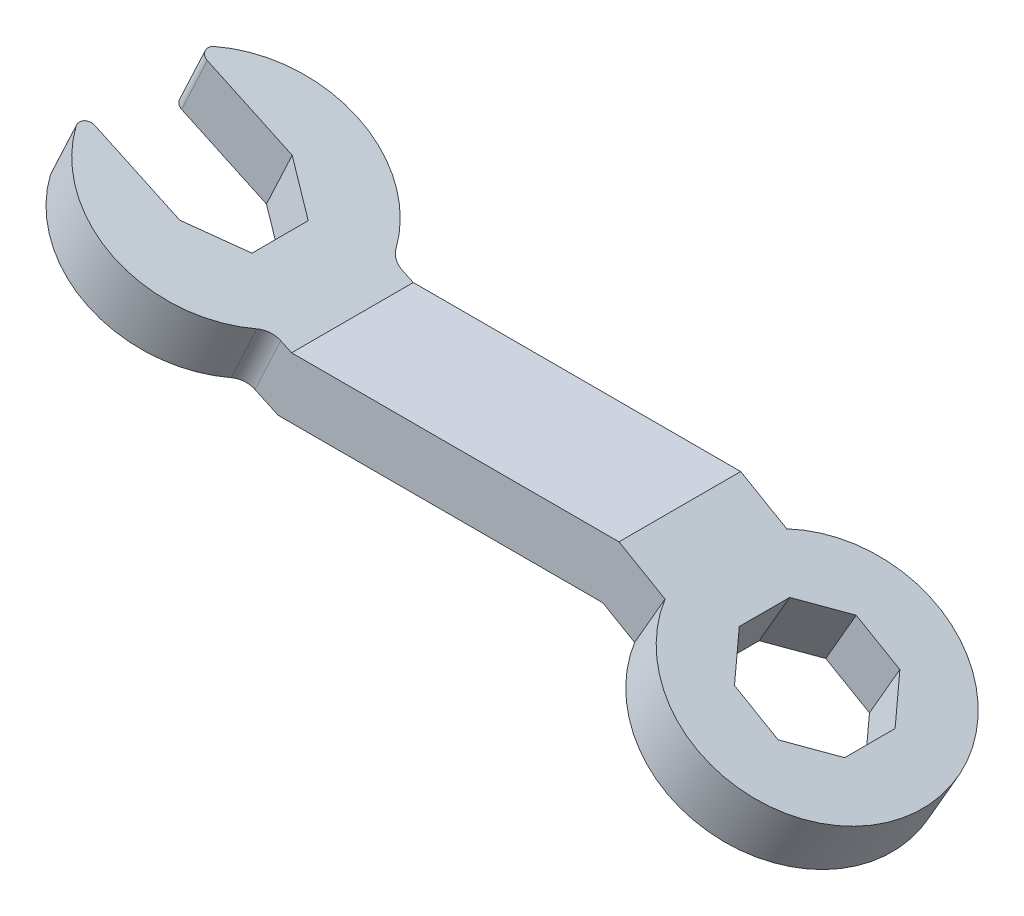
ISO-10303-21;
HEADER;
FILE_DESCRIPTION(('STEP AP214'),'2;1');
FILE_NAME('part.step','',(''),(''),'','','');
FILE_SCHEMA(('AUTOMOTIVE_DESIGN { 1 0 10303 214 1 1 1 1 }'));
ENDSEC;
DATA;
#1=APPLICATION_CONTEXT('core data for automotive mechanical design processes');
#2=APPLICATION_PROTOCOL_DEFINITION('international standard','automotive_design',2000,#1);
#3=PRODUCT_CONTEXT('',#1,'mechanical');
#4=PRODUCT('Part','Part','',(#3));
#5=PRODUCT_RELATED_PRODUCT_CATEGORY('part','',(#4));
#6=PRODUCT_DEFINITION_FORMATION('','',#4);
#7=PRODUCT_DEFINITION_CONTEXT('part definition',#1,'design');
#8=PRODUCT_DEFINITION('design','',#6,#7);
#9=PRODUCT_DEFINITION_SHAPE('','',#8);
#10=(LENGTH_UNIT() NAMED_UNIT(*) SI_UNIT(.MILLI.,.METRE.));
#11=(NAMED_UNIT(*) PLANE_ANGLE_UNIT() SI_UNIT($,.RADIAN.));
#12=(NAMED_UNIT(*) SI_UNIT($,.STERADIAN.) SOLID_ANGLE_UNIT());
#13=UNCERTAINTY_MEASURE_WITH_UNIT(LENGTH_MEASURE(1.E-05),#10,'distance_accuracy_value','');
#14=(GEOMETRIC_REPRESENTATION_CONTEXT(3) GLOBAL_UNCERTAINTY_ASSIGNED_CONTEXT((#13)) GLOBAL_UNIT_ASSIGNED_CONTEXT((#10,
#11,#12)) REPRESENTATION_CONTEXT('',''));
#15=CARTESIAN_POINT('',(0.,0.,0.));
#16=DIRECTION('',(0.,0.,1.));
#17=DIRECTION('',(1.,0.,0.));
#18=AXIS2_PLACEMENT_3D('',#15,#16,#17);
#19=CARTESIAN_POINT('',(0.,0.,15.));
#20=DIRECTION('',(0.422618261740694,0.906307787036653,0.));
#21=DIRECTION('',(-0.906307787036653,0.422618261740694,0.));
#22=AXIS2_PLACEMENT_3D('',#19,#20,#21);
#23=PLANE('',#22);
#24=DIRECTION('',(-0.906307787036653,0.422618261740693,0.));
#25=VECTOR('',#24,1.);
#26=CARTESIAN_POINT('',(0.,0.,-13.856406460551));
#27=LINE('',#26,#25);
#28=CARTESIAN_POINT('',(-31.7207725462829,14.7916391609243,-13.856406460551));
#29=VERTEX_POINT('',#28);
#30=CARTESIAN_POINT('',(-52.636156634353,24.5446429344444,-13.856406460551));
#31=VERTEX_POINT('',#30);
#32=EDGE_CURVE('E294',#29,#31,#27,.T.);
#33=ORIENTED_EDGE('',*,*,#32,.T.);
#34=CARTESIAN_POINT('',(-52.636156634353,24.5446429344444,-15.856406460551));
#35=DIRECTION('',(0.422618261740694,0.906307787036653,0.));
#36=DIRECTION('',(-0.906307787036653,0.422618261740694,0.));
#37=AXIS2_PLACEMENT_3D('',#34,#35,#36);
#38=CIRCLE('',#37,2.);
#39=CARTESIAN_POINT('',(-54.1301126406437,25.2412860611244,-16.989006922019));
#40=VERTEX_POINT('',#39);
#41=EDGE_CURVE('E446',#31,#40,#38,.F.);
#42=ORIENTED_EDGE('',*,*,#41,.T.);
#43=CARTESIAN_POINT('',(-31.7207725462829,14.7916391609243,0.));
#44=DIRECTION('',(-0.422618261740693,-0.906307787036653,0.));
#45=DIRECTION('',(0.906307787036653,-0.422618261740694,0.));
#46=AXIS2_PLACEMENT_3D('',#43,#44,#45);
#47=CIRCLE('',#46,30.);
#48=CARTESIAN_POINT('',(-9.40787886195159,4.38696596032248,-17.1428571428571));
#49=VERTEX_POINT('',#48);
#50=EDGE_CURVE('E299',#40,#49,#47,.T.);
#51=ORIENTED_EDGE('',*,*,#50,.T.);
#52=CARTESIAN_POINT('',(-5.68906324789638,2.65285376022218,-20.));
#53=DIRECTION('',(0.422618261740694,0.906307787036653,0.));
#54=DIRECTION('',(-0.906307787036653,0.422618261740694,0.));
#55=AXIS2_PLACEMENT_3D('',#52,#53,#54);
#56=CIRCLE('',#55,5.);
#57=CARTESIAN_POINT('',(-5.68906324789638,2.65285376022218,-15.));
#58=VERTEX_POINT('',#57);
#59=EDGE_CURVE('E435',#49,#58,#56,.T.);
#60=ORIENTED_EDGE('',*,*,#59,.T.);
#61=DIRECTION('',(0.906307787036653,-0.422618261740694,0.));
#62=VECTOR('',#61,1.);
#63=CARTESIAN_POINT('',(0.,0.,-15.));
#64=LINE('',#63,#62);
#65=CARTESIAN_POINT('',(0.,0.,-15.));
#66=VERTEX_POINT('',#65);
#67=EDGE_CURVE('E330',#58,#66,#64,.T.);
#68=ORIENTED_EDGE('',*,*,#67,.T.);
#69=DIRECTION('',(0.,0.,-1.));
#70=VECTOR('',#69,1.);
#71=CARTESIAN_POINT('',(0.,0.,15.));
#72=LINE('',#71,#70);
#73=CARTESIAN_POINT('',(0.,0.,15.));
#74=VERTEX_POINT('',#73);
#75=EDGE_CURVE('E380',#74,#66,#72,.T.);
#76=ORIENTED_EDGE('',*,*,#75,.F.);
#77=DIRECTION('',(0.906307787036653,-0.422618261740694,0.));
#78=VECTOR('',#77,1.);
#79=CARTESIAN_POINT('',(0.,0.,15.));
#80=LINE('',#79,#78);
#81=CARTESIAN_POINT('',(-5.68906324789638,2.65285376022218,15.));
#82=VERTEX_POINT('',#81);
#83=EDGE_CURVE('E406',#82,#74,#80,.T.);
#84=ORIENTED_EDGE('',*,*,#83,.F.);
#85=CARTESIAN_POINT('',(-5.68906324789638,2.65285376022218,20.));
#86=DIRECTION('',(0.422618261740694,0.906307787036653,0.));
#87=DIRECTION('',(-0.906307787036653,0.422618261740694,0.));
#88=AXIS2_PLACEMENT_3D('',#85,#86,#87);
#89=CIRCLE('',#88,5.);
#90=CARTESIAN_POINT('',(-9.40787886195159,4.38696596032248,17.1428571428571));
#91=VERTEX_POINT('',#90);
#92=EDGE_CURVE('E439',#82,#91,#89,.T.);
#93=ORIENTED_EDGE('',*,*,#92,.T.);
#94=CARTESIAN_POINT('',(-54.1301126406438,25.2412860611244,16.9890069220189));
#95=VERTEX_POINT('',#94);
#96=EDGE_CURVE('E297',#91,#95,#47,.T.);
#97=ORIENTED_EDGE('',*,*,#96,.T.);
#98=CARTESIAN_POINT('',(-52.636156634353,24.5446429344444,15.856406460551));
#99=DIRECTION('',(0.422618261740694,0.906307787036653,0.));
#100=DIRECTION('',(-0.906307787036653,0.422618261740694,0.));
#101=AXIS2_PLACEMENT_3D('',#98,#99,#100);
#102=CIRCLE('',#101,2.);
#103=CARTESIAN_POINT('',(-52.636156634353,24.5446429344444,13.856406460551));
#104=VERTEX_POINT('',#103);
#105=EDGE_CURVE('E444',#95,#104,#102,.F.);
#106=ORIENTED_EDGE('',*,*,#105,.T.);
#107=DIRECTION('',(-0.906307787036653,0.422618261740693,0.));
#108=VECTOR('',#107,1.);
#109=CARTESIAN_POINT('',(0.,0.,13.856406460551));
#110=LINE('',#109,#108);
#111=CARTESIAN_POINT('',(-31.7207725462829,14.7916391609243,13.856406460551));
#112=VERTEX_POINT('',#111);
#113=EDGE_CURVE('E301',#112,#104,#110,.T.);
#114=ORIENTED_EDGE('',*,*,#113,.F.);
#115=DIRECTION('',(0.784885567221399,-0.365998150770662,-0.5));
#116=VECTOR('',#115,1.);
#117=CARTESIAN_POINT('',(-8.37898816851127,3.90718635056686,-1.01313972081441));
#118=LINE('',#117,#116);
#119=CARTESIAN_POINT('',(-20.845079101843,9.72022002003597,6.92820323027551));
#120=VERTEX_POINT('',#119);
#121=EDGE_CURVE('E275',#112,#120,#118,.T.);
#122=ORIENTED_EDGE('',*,*,#121,.T.);
#123=DIRECTION('',(0.,0.,-1.));
#124=VECTOR('',#123,1.);
#125=CARTESIAN_POINT('',(-20.845079101843,9.72022002003596,15.));
#126=LINE('',#125,#124);
#127=CARTESIAN_POINT('',(-20.845079101843,9.72022002003597,-6.92820323027551));
#128=VERTEX_POINT('',#127);
#129=EDGE_CURVE('E298',#120,#128,#126,.T.);
#130=ORIENTED_EDGE('',*,*,#129,.T.);
#131=DIRECTION('',(-0.784885567221398,0.365998150770662,-0.5));
#132=VECTOR('',#131,1.);
#133=CARTESIAN_POINT('',(3.39429533980969,-1.58278591099305,8.51313972081442));
#134=LINE('',#133,#132);
#135=EDGE_CURVE('E476',#128,#29,#134,.T.);
#136=ORIENTED_EDGE('',*,*,#135,.T.);
#137=EDGE_LOOP('',(#33,#42,#51,#60,#68,#76,#84,#93,#97,#106,#114,#122,#130,#136));
#138=FACE_BOUND('',#137,.T.);
#139=ADVANCED_FACE('F95',(#138),#23,.F.);
#140=CARTESIAN_POINT('',(0.,0.,15.));
#141=DIRECTION('',(0.,1.,0.));
#142=DIRECTION('',(0.,0.,1.));
#143=AXIS2_PLACEMENT_3D('',#140,#141,#142);
#144=PLANE('',#143);
#145=DIRECTION('',(1.,0.,0.));
#146=VECTOR('',#145,1.);
#147=CARTESIAN_POINT('',(0.,0.,-15.));
#148=LINE('',#147,#146);
#149=CARTESIAN_POINT('',(80.,0.,-15.));
#150=VERTEX_POINT('',#149);
#151=EDGE_CURVE('E384',#66,#150,#148,.T.);
#152=ORIENTED_EDGE('',*,*,#151,.T.);
#153=DIRECTION('',(0.,0.,-1.));
#154=VECTOR('',#153,1.);
#155=CARTESIAN_POINT('',(80.,0.,15.));
#156=LINE('',#155,#154);
#157=CARTESIAN_POINT('',(80.,0.,15.));
#158=VERTEX_POINT('',#157);
#159=EDGE_CURVE('E385',#158,#150,#156,.T.);
#160=ORIENTED_EDGE('',*,*,#159,.F.);
#161=DIRECTION('',(1.,0.,0.));
#162=VECTOR('',#161,1.);
#163=CARTESIAN_POINT('',(0.,0.,15.));
#164=LINE('',#163,#162);
#165=EDGE_CURVE('E409',#74,#158,#164,.T.);
#166=ORIENTED_EDGE('',*,*,#165,.F.);
#167=ORIENTED_EDGE('',*,*,#75,.T.);
#168=EDGE_LOOP('',(#152,#160,#166,#167));
#169=FACE_BOUND('',#168,.T.);
#170=ADVANCED_FACE('F493',(#169),#144,.F.);
#171=CARTESIAN_POINT('',(80.,0.,15.));
#172=DIRECTION('',(0.500000000000001,0.866025403784438,0.));
#173=DIRECTION('',(-0.866025403784438,0.500000000000002,0.));
#174=AXIS2_PLACEMENT_3D('',#171,#172,#173);
#175=PLANE('',#174);
#176=DIRECTION('',(0.866025403784438,-0.500000000000002,0.));
#177=VECTOR('',#176,1.);
#178=CARTESIAN_POINT('',(80.,0.,-15.));
#179=LINE('',#178,#177);
#180=CARTESIAN_POINT('',(87.8656981257962,-4.54126293029279,-15.));
#181=VERTEX_POINT('',#180);
#182=EDGE_CURVE('E383',#150,#181,#179,.T.);
#183=ORIENTED_EDGE('',*,*,#182,.T.);
#184=CARTESIAN_POINT('',(110.365698125796,-17.5316439870594,0.));
#185=DIRECTION('',(0.500000000000001,0.866025403784438,0.));
#186=DIRECTION('',(-0.866025403784438,0.500000000000002,0.));
#187=AXIS2_PLACEMENT_3D('',#184,#185,#186);
#188=CIRCLE('',#187,30.);
#189=CARTESIAN_POINT('',(87.8656981257962,-4.54126293029278,15.));
#190=VERTEX_POINT('',#189);
#191=EDGE_CURVE('E309',#181,#190,#188,.F.);
#192=ORIENTED_EDGE('',*,*,#191,.T.);
#193=DIRECTION('',(0.866025403784438,-0.500000000000002,0.));
#194=VECTOR('',#193,1.);
#195=CARTESIAN_POINT('',(80.,0.,15.));
#196=LINE('',#195,#194);
#197=EDGE_CURVE('E379',#158,#190,#196,.T.);
#198=ORIENTED_EDGE('',*,*,#197,.F.);
#199=ORIENTED_EDGE('',*,*,#159,.T.);
#200=EDGE_LOOP('',(#183,#192,#198,#199));
#201=FACE_BOUND('',#200,.T.);
#202=DIRECTION('',(0.,0.,1.));
#203=VECTOR('',#202,1.);
#204=CARTESIAN_POINT('',(123.356079182563,-25.0316439870594,6.21320343559643));
#205=LINE('',#204,#203);
#206=CARTESIAN_POINT('',(123.356079182563,-25.0316439870594,-6.21320343559644));
#207=VERTEX_POINT('',#206);
#208=CARTESIAN_POINT('',(123.356079182563,-25.0316439870594,6.21320343559643));
#209=VERTEX_POINT('',#208);
#210=EDGE_CURVE('E328',#207,#209,#205,.T.);
#211=ORIENTED_EDGE('',*,*,#210,.F.);
#212=DIRECTION('',(0.612372435695794,-0.353553390593275,0.707106781186548));
#213=VECTOR('',#212,1.);
#214=CARTESIAN_POINT('',(123.356079182563,-25.0316439870594,-6.21320343559642));
#215=LINE('',#214,#213);
#216=CARTESIAN_POINT('',(115.746490139903,-20.6382457048576,-15.));
#217=VERTEX_POINT('',#216);
#218=EDGE_CURVE('E306',#217,#207,#215,.T.);
#219=ORIENTED_EDGE('',*,*,#218,.F.);
#220=DIRECTION('',(0.866025403784438,-0.500000000000001,0.));
#221=VECTOR('',#220,1.);
#222=CARTESIAN_POINT('',(115.746490139903,-20.6382457048576,-15.));
#223=LINE('',#222,#221);
#224=CARTESIAN_POINT('',(104.984906111689,-14.4250422692612,-15.));
#225=VERTEX_POINT('',#224);
#226=EDGE_CURVE('E310',#225,#217,#223,.T.);
#227=ORIENTED_EDGE('',*,*,#226,.F.);
#228=DIRECTION('',(0.612372435695794,-0.353553390593275,-0.707106781186548));
#229=VECTOR('',#228,1.);
#230=CARTESIAN_POINT('',(104.984906111689,-14.4250422692612,-15.));
#231=LINE('',#230,#229);
#232=CARTESIAN_POINT('',(97.3753170690296,-10.0316439870594,-6.21320343559641));
#233=VERTEX_POINT('',#232);
#234=EDGE_CURVE('E313',#233,#225,#231,.T.);
#235=ORIENTED_EDGE('',*,*,#234,.F.);
#236=DIRECTION('',(0.,0.,-1.));
#237=VECTOR('',#236,1.);
#238=CARTESIAN_POINT('',(97.3753170690296,-10.0316439870594,-6.21320343559641));
#239=LINE('',#238,#237);
#240=CARTESIAN_POINT('',(97.3753170690296,-10.0316439870594,6.21320343559641));
#241=VERTEX_POINT('',#240);
#242=EDGE_CURVE('E316',#241,#233,#239,.T.);
#243=ORIENTED_EDGE('',*,*,#242,.F.);
#244=DIRECTION('',(-0.612372435695794,0.353553390593275,-0.707106781186547));
#245=VECTOR('',#244,1.);
#246=CARTESIAN_POINT('',(97.3753170690296,-10.0316439870594,6.21320343559642));
#247=LINE('',#246,#245);
#248=CARTESIAN_POINT('',(104.984906111689,-14.4250422692612,15.));
#249=VERTEX_POINT('',#248);
#250=EDGE_CURVE('E319',#249,#241,#247,.T.);
#251=ORIENTED_EDGE('',*,*,#250,.F.);
#252=DIRECTION('',(-0.866025403784438,0.500000000000001,0.));
#253=VECTOR('',#252,1.);
#254=CARTESIAN_POINT('',(104.984906111689,-14.4250422692612,15.));
#255=LINE('',#254,#253);
#256=CARTESIAN_POINT('',(115.746490139903,-20.6382457048576,15.));
#257=VERTEX_POINT('',#256);
#258=EDGE_CURVE('E322',#257,#249,#255,.T.);
#259=ORIENTED_EDGE('',*,*,#258,.F.);
#260=DIRECTION('',(-0.612372435695794,0.353553390593275,0.707106781186548));
#261=VECTOR('',#260,1.);
#262=CARTESIAN_POINT('',(115.746490139903,-20.6382457048576,15.));
#263=LINE('',#262,#261);
#264=EDGE_CURVE('E325',#209,#257,#263,.T.);
#265=ORIENTED_EDGE('',*,*,#264,.F.);
#266=EDGE_LOOP('',(#211,#219,#227,#235,#243,#251,#259,#265));
#267=FACE_BOUND('',#266,.T.);
#268=ADVANCED_FACE('F500',(#201,#267),#175,.F.);
#269=CARTESIAN_POINT('',(114.330127018922,-2.50000000000004,15.));
#270=DIRECTION('',(-0.500000000000002,-0.866025403784438,0.));
#271=DIRECTION('',(0.866025403784438,-0.500000000000002,0.));
#272=AXIS2_PLACEMENT_3D('',#269,#270,#271);
#273=PLANE('',#272);
#274=DIRECTION('',(-0.866025403784438,0.500000000000002,0.));
#275=VECTOR('',#274,1.);
#276=CARTESIAN_POINT('',(114.330127018922,-2.50000000000004,15.));
#277=LINE('',#276,#275);
#278=CARTESIAN_POINT('',(95.3656981257962,8.44911812647381,15.));
#279=VERTEX_POINT('',#278);
#280=CARTESIAN_POINT('',(84.0192378864669,15.,15.));
#281=VERTEX_POINT('',#280);
#282=EDGE_CURVE('E397',#279,#281,#277,.T.);
#283=ORIENTED_EDGE('',*,*,#282,.F.);
#284=CARTESIAN_POINT('',(117.865698125796,-4.5412629302928,0.));
#285=DIRECTION('',(0.500000000000001,0.866025403784438,0.));
#286=DIRECTION('',(-0.866025403784438,0.500000000000001,0.));
#287=AXIS2_PLACEMENT_3D('',#284,#285,#286);
#288=CIRCLE('',#287,30.);
#289=CARTESIAN_POINT('',(95.3656981257962,8.44911812647381,-15.));
#290=VERTEX_POINT('',#289);
#291=EDGE_CURVE('E357',#279,#290,#288,.T.);
#292=ORIENTED_EDGE('',*,*,#291,.T.);
#293=DIRECTION('',(-0.866025403784438,0.500000000000002,0.));
#294=VECTOR('',#293,1.);
#295=CARTESIAN_POINT('',(114.330127018922,-2.50000000000004,-15.));
#296=LINE('',#295,#294);
#297=CARTESIAN_POINT('',(84.0192378864669,15.,-15.));
#298=VERTEX_POINT('',#297);
#299=EDGE_CURVE('E388',#290,#298,#296,.T.);
#300=ORIENTED_EDGE('',*,*,#299,.T.);
#301=DIRECTION('',(0.,0.,-1.));
#302=VECTOR('',#301,1.);
#303=CARTESIAN_POINT('',(84.0192378864669,15.,15.));
#304=LINE('',#303,#302);
#305=EDGE_CURVE('E389',#281,#298,#304,.T.);
#306=ORIENTED_EDGE('',*,*,#305,.F.);
#307=EDGE_LOOP('',(#283,#292,#300,#306));
#308=FACE_BOUND('',#307,.T.);
#309=DIRECTION('',(0.612372435695794,-0.353553390593274,-0.707106781186548));
#310=VECTOR('',#309,1.);
#311=CARTESIAN_POINT('',(123.246490139903,-7.64786464809102,15.));
#312=LINE('',#311,#310);
#313=CARTESIAN_POINT('',(123.246490139903,-7.64786464809102,15.));
#314=VERTEX_POINT('',#313);
#315=CARTESIAN_POINT('',(130.856079182563,-12.0412629302928,6.21320343559643));
#316=VERTEX_POINT('',#315);
#317=EDGE_CURVE('E304',#314,#316,#312,.T.);
#318=ORIENTED_EDGE('',*,*,#317,.F.);
#319=DIRECTION('',(0.866025403784438,-0.500000000000001,0.));
#320=VECTOR('',#319,1.);
#321=CARTESIAN_POINT('',(112.484906111689,-1.43466121249459,15.));
#322=LINE('',#321,#320);
#323=CARTESIAN_POINT('',(112.484906111689,-1.43466121249459,15.));
#324=VERTEX_POINT('',#323);
#325=EDGE_CURVE('E351',#324,#314,#322,.T.);
#326=ORIENTED_EDGE('',*,*,#325,.F.);
#327=DIRECTION('',(0.612372435695794,-0.353553390593275,0.707106781186547));
#328=VECTOR('',#327,1.);
#329=CARTESIAN_POINT('',(104.87531706903,2.95873706970722,6.21320343559641));
#330=LINE('',#329,#328);
#331=CARTESIAN_POINT('',(104.87531706903,2.95873706970722,6.21320343559641));
#332=VERTEX_POINT('',#331);
#333=EDGE_CURVE('E348',#332,#324,#330,.T.);
#334=ORIENTED_EDGE('',*,*,#333,.F.);
#335=DIRECTION('',(0.,0.,1.));
#336=VECTOR('',#335,1.);
#337=CARTESIAN_POINT('',(104.87531706903,2.95873706970722,-6.21320343559641));
#338=LINE('',#337,#336);
#339=CARTESIAN_POINT('',(104.87531706903,2.95873706970722,-6.21320343559641));
#340=VERTEX_POINT('',#339);
#341=EDGE_CURVE('E345',#340,#332,#338,.T.);
#342=ORIENTED_EDGE('',*,*,#341,.F.);
#343=DIRECTION('',(-0.612372435695794,0.353553390593274,0.707106781186547));
#344=VECTOR('',#343,1.);
#345=CARTESIAN_POINT('',(112.484906111689,-1.43466121249458,-15.));
#346=LINE('',#345,#344);
#347=CARTESIAN_POINT('',(112.484906111689,-1.43466121249458,-15.));
#348=VERTEX_POINT('',#347);
#349=EDGE_CURVE('E342',#348,#340,#346,.T.);
#350=ORIENTED_EDGE('',*,*,#349,.F.);
#351=DIRECTION('',(-0.866025403784438,0.500000000000001,0.));
#352=VECTOR('',#351,1.);
#353=CARTESIAN_POINT('',(123.246490139903,-7.64786464809102,-15.));
#354=LINE('',#353,#352);
#355=CARTESIAN_POINT('',(123.246490139903,-7.64786464809102,-15.));
#356=VERTEX_POINT('',#355);
#357=EDGE_CURVE('E339',#356,#348,#354,.T.);
#358=ORIENTED_EDGE('',*,*,#357,.F.);
#359=DIRECTION('',(-0.612372435695793,0.353553390593275,-0.707106781186548));
#360=VECTOR('',#359,1.);
#361=CARTESIAN_POINT('',(130.856079182563,-12.0412629302928,-6.21320343559644));
#362=LINE('',#361,#360);
#363=CARTESIAN_POINT('',(130.856079182563,-12.0412629302928,-6.21320343559644));
#364=VERTEX_POINT('',#363);
#365=EDGE_CURVE('E336',#364,#356,#362,.T.);
#366=ORIENTED_EDGE('',*,*,#365,.F.);
#367=DIRECTION('',(0.,0.,-1.));
#368=VECTOR('',#367,1.);
#369=CARTESIAN_POINT('',(130.856079182563,-12.0412629302928,6.21320343559643));
#370=LINE('',#369,#368);
#371=EDGE_CURVE('E333',#316,#364,#370,.T.);
#372=ORIENTED_EDGE('',*,*,#371,.F.);
#373=EDGE_LOOP('',(#318,#326,#334,#342,#350,#358,#366,#372));
#374=FACE_BOUND('',#373,.T.);
#375=ADVANCED_FACE('F510',(#308,#374),#273,.F.);
#376=CARTESIAN_POINT('',(84.0192378864669,15.,15.));
#377=DIRECTION('',(0.,-1.,0.));
#378=DIRECTION('',(1.,0.,0.));
#379=AXIS2_PLACEMENT_3D('',#376,#377,#378);
#380=PLANE('',#379);
#381=DIRECTION('',(-1.,0.,0.));
#382=VECTOR('',#381,1.);
#383=CARTESIAN_POINT('',(84.0192378864669,15.,-15.));
#384=LINE('',#383,#382);
#385=CARTESIAN_POINT('',(3.32541993964407,15.,-15.));
#386=VERTEX_POINT('',#385);
#387=EDGE_CURVE('E393',#298,#386,#384,.T.);
#388=ORIENTED_EDGE('',*,*,#387,.T.);
#389=DIRECTION('',(0.,0.,-1.));
#390=VECTOR('',#389,1.);
#391=CARTESIAN_POINT('',(3.32541993964407,15.,15.));
#392=LINE('',#391,#390);
#393=CARTESIAN_POINT('',(3.32541993964407,15.,15.));
#394=VERTEX_POINT('',#393);
#395=EDGE_CURVE('E394',#394,#386,#392,.T.);
#396=ORIENTED_EDGE('',*,*,#395,.F.);
#397=DIRECTION('',(-1.,0.,0.));
#398=VECTOR('',#397,1.);
#399=CARTESIAN_POINT('',(84.0192378864669,15.,15.));
#400=LINE('',#399,#398);
#401=EDGE_CURVE('E407',#281,#394,#400,.T.);
#402=ORIENTED_EDGE('',*,*,#401,.F.);
#403=ORIENTED_EDGE('',*,*,#305,.T.);
#404=EDGE_LOOP('',(#388,#396,#402,#403));
#405=FACE_BOUND('',#404,.T.);
#406=ADVANCED_FACE('F507',(#405),#380,.F.);
#407=CARTESIAN_POINT('',(3.32541993964407,15.,15.));
#408=DIRECTION('',(-0.422618261740694,-0.906307787036653,0.));
#409=DIRECTION('',(0.906307787036653,-0.422618261740694,0.));
#410=AXIS2_PLACEMENT_3D('',#407,#408,#409);
#411=PLANE('',#410);
#412=CARTESIAN_POINT('',(-25.3814986201725,28.3862559664741,0.));
#413=DIRECTION('',(-0.422618261740693,-0.906307787036653,0.));
#414=DIRECTION('',(0.906307787036653,-0.422618261740694,0.));
#415=AXIS2_PLACEMENT_3D('',#412,#413,#414);
#416=CIRCLE('',#415,30.);
#417=CARTESIAN_POINT('',(-47.7908387145333,38.8359028666742,-16.989006922019));
#418=VERTEX_POINT('',#417);
#419=CARTESIAN_POINT('',(-3.06860493584119,17.9815827658723,-17.1428571428571));
#420=VERTEX_POINT('',#419);
#421=EDGE_CURVE('E288',#418,#420,#416,.T.);
#422=ORIENTED_EDGE('',*,*,#421,.F.);
#423=CARTESIAN_POINT('',(-46.2968827082426,38.1392597399942,-15.856406460551));
#424=DIRECTION('',(-0.422618261740694,-0.906307787036653,0.));
#425=DIRECTION('',(0.906307787036653,-0.422618261740694,0.));
#426=AXIS2_PLACEMENT_3D('',#423,#424,#425);
#427=CIRCLE('',#426,2.);
#428=CARTESIAN_POINT('',(-46.2968827082426,38.1392597399942,-13.856406460551));
#429=VERTEX_POINT('',#428);
#430=EDGE_CURVE('E451',#418,#429,#427,.F.);
#431=ORIENTED_EDGE('',*,*,#430,.T.);
#432=DIRECTION('',(-0.906307787036653,0.422618261740693,0.));
#433=VECTOR('',#432,1.);
#434=CARTESIAN_POINT('',(6.3392739261104,13.5946168055498,-13.856406460551));
#435=LINE('',#434,#433);
#436=CARTESIAN_POINT('',(-25.3814986201725,28.3862559664741,-13.856406460551));
#437=VERTEX_POINT('',#436);
#438=EDGE_CURVE('E303',#437,#429,#435,.T.);
#439=ORIENTED_EDGE('',*,*,#438,.F.);
#440=DIRECTION('',(0.784885567221398,-0.365998150770662,0.5));
#441=VECTOR('',#440,1.);
#442=CARTESIAN_POINT('',(7.47317877607034,13.0658682903944,7.0731906478229));
#443=LINE('',#442,#441);
#444=CARTESIAN_POINT('',(-14.5058051757326,23.3148368255857,-6.92820323027551));
#445=VERTEX_POINT('',#444);
#446=EDGE_CURVE('E479',#437,#445,#443,.T.);
#447=ORIENTED_EDGE('',*,*,#446,.T.);
#448=DIRECTION('',(0.,0.,1.));
#449=VECTOR('',#448,1.);
#450=CARTESIAN_POINT('',(-14.5058051757326,23.3148368255858,15.));
#451=LINE('',#450,#449);
#452=CARTESIAN_POINT('',(-14.5058051757326,23.3148368255857,6.92820323027551));
#453=VERTEX_POINT('',#452);
#454=EDGE_CURVE('E284',#445,#453,#451,.T.);
#455=ORIENTED_EDGE('',*,*,#454,.T.);
#456=DIRECTION('',(-0.784885567221399,0.365998150770662,0.5));
#457=VECTOR('',#456,1.);
#458=CARTESIAN_POINT('',(-4.30010473225062,18.5558405519543,0.426809352177102));
#459=LINE('',#458,#457);
#460=CARTESIAN_POINT('',(-25.3814986201725,28.3862559664741,13.856406460551));
#461=VERTEX_POINT('',#460);
#462=EDGE_CURVE('E272',#453,#461,#459,.T.);
#463=ORIENTED_EDGE('',*,*,#462,.T.);
#464=DIRECTION('',(-0.906307787036653,0.422618261740693,0.));
#465=VECTOR('',#464,1.);
#466=CARTESIAN_POINT('',(6.3392739261104,13.5946168055498,13.856406460551));
#467=LINE('',#466,#465);
#468=CARTESIAN_POINT('',(-46.2968827082426,38.1392597399942,13.856406460551));
#469=VERTEX_POINT('',#468);
#470=EDGE_CURVE('E278',#461,#469,#467,.T.);
#471=ORIENTED_EDGE('',*,*,#470,.T.);
#472=CARTESIAN_POINT('',(-46.2968827082426,38.1392597399942,15.856406460551));
#473=DIRECTION('',(-0.422618261740694,-0.906307787036653,0.));
#474=DIRECTION('',(0.906307787036653,-0.422618261740694,0.));
#475=AXIS2_PLACEMENT_3D('',#472,#473,#474);
#476=CIRCLE('',#475,2.);
#477=CARTESIAN_POINT('',(-47.7908387145334,38.8359028666742,16.9890069220189));
#478=VERTEX_POINT('',#477);
#479=EDGE_CURVE('E110',#469,#478,#476,.F.);
#480=ORIENTED_EDGE('',*,*,#479,.T.);
#481=CARTESIAN_POINT('',(-3.06860493584119,17.9815827658723,17.1428571428571));
#482=VERTEX_POINT('',#481);
#483=EDGE_CURVE('E290',#482,#478,#416,.T.);
#484=ORIENTED_EDGE('',*,*,#483,.F.);
#485=CARTESIAN_POINT('',(0.650210678214026,16.247470565772,20.));
#486=DIRECTION('',(-0.422618261740694,-0.906307787036653,0.));
#487=DIRECTION('',(0.906307787036653,-0.422618261740694,0.));
#488=AXIS2_PLACEMENT_3D('',#485,#486,#487);
#489=CIRCLE('',#488,5.);
#490=CARTESIAN_POINT('',(0.650210678214026,16.247470565772,15.));
#491=VERTEX_POINT('',#490);
#492=EDGE_CURVE('E437',#482,#491,#489,.T.);
#493=ORIENTED_EDGE('',*,*,#492,.T.);
#494=DIRECTION('',(-0.906307787036653,0.422618261740694,0.));
#495=VECTOR('',#494,1.);
#496=CARTESIAN_POINT('',(3.32541993964407,15.,15.));
#497=LINE('',#496,#495);
#498=EDGE_CURVE('E403',#394,#491,#497,.T.);
#499=ORIENTED_EDGE('',*,*,#498,.F.);
#500=ORIENTED_EDGE('',*,*,#395,.T.);
#501=DIRECTION('',(-0.906307787036653,0.422618261740694,0.));
#502=VECTOR('',#501,1.);
#503=CARTESIAN_POINT('',(3.32541993964407,15.,-15.));
#504=LINE('',#503,#502);
#505=CARTESIAN_POINT('',(0.650210678214027,16.247470565772,-15.));
#506=VERTEX_POINT('',#505);
#507=EDGE_CURVE('E392',#386,#506,#504,.T.);
#508=ORIENTED_EDGE('',*,*,#507,.T.);
#509=CARTESIAN_POINT('',(0.650210678214026,16.247470565772,-20.));
#510=DIRECTION('',(-0.422618261740694,-0.906307787036653,0.));
#511=DIRECTION('',(0.906307787036653,-0.422618261740694,0.));
#512=AXIS2_PLACEMENT_3D('',#509,#510,#511);
#513=CIRCLE('',#512,5.);
#514=EDGE_CURVE('E432',#506,#420,#513,.T.);
#515=ORIENTED_EDGE('',*,*,#514,.T.);
#516=EDGE_LOOP('',(#422,#431,#439,#447,#455,#463,#471,#480,#484,#493,#499,#500,#508,#515));
#517=FACE_BOUND('',#516,.T.);
#518=ADVANCED_FACE('F282',(#517),#411,.F.);
#519=CARTESIAN_POINT('',(0.,0.,15.));
#520=DIRECTION('',(0.,0.,1.));
#521=DIRECTION('',(1.,0.,0.));
#522=AXIS2_PLACEMENT_3D('',#519,#520,#521);
#523=PLANE('',#522);
#524=ORIENTED_EDGE('',*,*,#498,.T.);
#525=DIRECTION('',(0.422618261740694,0.906307787036653,0.));
#526=VECTOR('',#525,1.);
#527=CARTESIAN_POINT('',(-5.68906324789638,2.65285376022218,15.));
#528=LINE('',#527,#526);
#529=EDGE_CURVE('E430',#491,#82,#528,.F.);
#530=ORIENTED_EDGE('',*,*,#529,.T.);
#531=ORIENTED_EDGE('',*,*,#83,.T.);
#532=ORIENTED_EDGE('',*,*,#165,.T.);
#533=ORIENTED_EDGE('',*,*,#197,.T.);
#534=DIRECTION('',(0.500000000000001,0.866025403784438,0.));
#535=VECTOR('',#534,1.);
#536=CARTESIAN_POINT('',(53.2279732344948,-64.5355623006198,15.));
#537=LINE('',#536,#535);
#538=EDGE_CURVE('E378',#279,#190,#537,.F.);
#539=ORIENTED_EDGE('',*,*,#538,.F.);
#540=ORIENTED_EDGE('',*,*,#282,.T.);
#541=ORIENTED_EDGE('',*,*,#401,.T.);
#542=EDGE_LOOP('',(#524,#530,#531,#532,#533,#539,#540,#541));
#543=FACE_BOUND('',#542,.T.);
#544=ADVANCED_FACE('F513',(#543),#523,.T.);
#545=CARTESIAN_POINT('',(0.,0.,-15.));
#546=DIRECTION('',(0.,0.,1.));
#547=DIRECTION('',(1.,0.,0.));
#548=AXIS2_PLACEMENT_3D('',#545,#546,#547);
#549=PLANE('',#548);
#550=ORIENTED_EDGE('',*,*,#67,.F.);
#551=DIRECTION('',(-0.422618261740694,-0.906307787036653,0.));
#552=VECTOR('',#551,1.);
#553=CARTESIAN_POINT('',(-5.68906324789638,2.65285376022218,-15.));
#554=LINE('',#553,#552);
#555=EDGE_CURVE('E421',#58,#506,#554,.F.);
#556=ORIENTED_EDGE('',*,*,#555,.T.);
#557=ORIENTED_EDGE('',*,*,#507,.F.);
#558=ORIENTED_EDGE('',*,*,#387,.F.);
#559=ORIENTED_EDGE('',*,*,#299,.F.);
#560=DIRECTION('',(0.500000000000001,0.866025403784438,0.));
#561=VECTOR('',#560,1.);
#562=CARTESIAN_POINT('',(53.2279732344948,-64.5355623006198,-15.));
#563=LINE('',#562,#561);
#564=EDGE_CURVE('E375',#290,#181,#563,.F.);
#565=ORIENTED_EDGE('',*,*,#564,.T.);
#566=ORIENTED_EDGE('',*,*,#182,.F.);
#567=ORIENTED_EDGE('',*,*,#151,.F.);
#568=EDGE_LOOP('',(#550,#556,#557,#558,#559,#565,#566,#567));
#569=FACE_BOUND('',#568,.T.);
#570=ADVANCED_FACE('F514',(#569),#549,.F.);
#571=CARTESIAN_POINT('',(67.9392912546032,-91.0163362705547,0.));
#572=DIRECTION('',(0.500000000000001,0.866025403784438,0.));
#573=DIRECTION('',(-0.866025403784438,0.500000000000001,0.));
#574=AXIS2_PLACEMENT_3D('',#571,#572,#573);
#575=CYLINDRICAL_SURFACE('',#574,30.);
#576=ORIENTED_EDGE('',*,*,#291,.F.);
#577=ORIENTED_EDGE('',*,*,#538,.T.);
#578=ORIENTED_EDGE('',*,*,#191,.F.);
#579=ORIENTED_EDGE('',*,*,#564,.F.);
#580=EDGE_LOOP('',(#576,#577,#578,#579));
#581=FACE_BOUND('',#580,.T.);
#582=ADVANCED_FACE('F504',(#581),#575,.T.);
#583=CARTESIAN_POINT('',(80.9296723113698,-98.5163362705547,6.21320343559643));
#584=DIRECTION('',(0.866025403784438,-0.500000000000001,0.));
#585=DIRECTION('',(0.500000000000001,0.866025403784438,0.));
#586=AXIS2_PLACEMENT_3D('',#583,#584,#585);
#587=PLANE('',#586);
#588=DIRECTION('',(0.500000000000001,0.866025403784438,0.));
#589=VECTOR('',#588,1.);
#590=CARTESIAN_POINT('',(80.9296723113698,-98.5163362705547,-6.21320343559644));
#591=LINE('',#590,#589);
#592=EDGE_CURVE('E368',#207,#364,#591,.T.);
#593=ORIENTED_EDGE('',*,*,#592,.F.);
#594=ORIENTED_EDGE('',*,*,#210,.T.);
#595=DIRECTION('',(0.500000000000001,0.866025403784438,0.));
#596=VECTOR('',#595,1.);
#597=CARTESIAN_POINT('',(80.9296723113698,-98.5163362705547,6.21320343559643));
#598=LINE('',#597,#596);
#599=EDGE_CURVE('E354',#209,#316,#598,.T.);
#600=ORIENTED_EDGE('',*,*,#599,.T.);
#601=ORIENTED_EDGE('',*,*,#371,.T.);
#602=EDGE_LOOP('',(#593,#594,#600,#601));
#603=FACE_BOUND('',#602,.T.);
#604=ADVANCED_FACE('F639',(#603),#587,.F.);
#605=CARTESIAN_POINT('',(80.9296723113698,-98.5163362705547,-6.21320343559644));
#606=DIRECTION('',(0.612372435695794,-0.353553390593275,-0.707106781186547));
#607=DIRECTION('',(-0.755928946018454,0.,-0.654653670707977));
#608=AXIS2_PLACEMENT_3D('',#605,#606,#607);
#609=PLANE('',#608);
#610=DIRECTION('',(0.500000000000001,0.866025403784438,0.));
#611=VECTOR('',#610,1.);
#612=CARTESIAN_POINT('',(73.3200832687105,-94.1229379883529,-15.));
#613=LINE('',#612,#611);
#614=EDGE_CURVE('E366',#217,#356,#613,.T.);
#615=ORIENTED_EDGE('',*,*,#614,.F.);
#616=ORIENTED_EDGE('',*,*,#218,.T.);
#617=ORIENTED_EDGE('',*,*,#592,.T.);
#618=ORIENTED_EDGE('',*,*,#365,.T.);
#619=EDGE_LOOP('',(#615,#616,#617,#618));
#620=FACE_BOUND('',#619,.T.);
#621=ADVANCED_FACE('F630',(#620),#609,.F.);
#622=CARTESIAN_POINT('',(73.3200832687105,-94.1229379883529,-15.));
#623=DIRECTION('',(0.,0.,-1.));
#624=DIRECTION('',(-1.,0.,0.));
#625=AXIS2_PLACEMENT_3D('',#622,#623,#624);
#626=PLANE('',#625);
#627=DIRECTION('',(0.500000000000001,0.866025403784438,0.));
#628=VECTOR('',#627,1.);
#629=CARTESIAN_POINT('',(62.558499240496,-87.9097345527565,-15.));
#630=LINE('',#629,#628);
#631=EDGE_CURVE('E364',#225,#348,#630,.T.);
#632=ORIENTED_EDGE('',*,*,#631,.F.);
#633=ORIENTED_EDGE('',*,*,#226,.T.);
#634=ORIENTED_EDGE('',*,*,#614,.T.);
#635=ORIENTED_EDGE('',*,*,#357,.T.);
#636=EDGE_LOOP('',(#632,#633,#634,#635));
#637=FACE_BOUND('',#636,.T.);
#638=ADVANCED_FACE('F621',(#637),#626,.F.);
#639=CARTESIAN_POINT('',(62.558499240496,-87.9097345527565,-15.));
#640=DIRECTION('',(-0.612372435695794,0.353553390593275,-0.707106781186548));
#641=DIRECTION('',(-0.755928946018455,0.,0.654653670707977));
#642=AXIS2_PLACEMENT_3D('',#639,#640,#641);
#643=PLANE('',#642);
#644=DIRECTION('',(0.500000000000001,0.866025403784438,0.));
#645=VECTOR('',#644,1.);
#646=CARTESIAN_POINT('',(54.9489101978367,-83.5163362705547,-6.21320343559641));
#647=LINE('',#646,#645);
#648=EDGE_CURVE('E362',#233,#340,#647,.T.);
#649=ORIENTED_EDGE('',*,*,#648,.F.);
#650=ORIENTED_EDGE('',*,*,#234,.T.);
#651=ORIENTED_EDGE('',*,*,#631,.T.);
#652=ORIENTED_EDGE('',*,*,#349,.T.);
#653=EDGE_LOOP('',(#649,#650,#651,#652));
#654=FACE_BOUND('',#653,.T.);
#655=ADVANCED_FACE('F612',(#654),#643,.F.);
#656=CARTESIAN_POINT('',(54.9489101978367,-83.5163362705547,-6.21320343559641));
#657=DIRECTION('',(-0.866025403784438,0.500000000000001,0.));
#658=DIRECTION('',(-0.500000000000001,-0.866025403784438,0.));
#659=AXIS2_PLACEMENT_3D('',#656,#657,#658);
#660=PLANE('',#659);
#661=DIRECTION('',(0.500000000000001,0.866025403784438,0.));
#662=VECTOR('',#661,1.);
#663=CARTESIAN_POINT('',(54.9489101978367,-83.5163362705547,6.21320343559641));
#664=LINE('',#663,#662);
#665=EDGE_CURVE('E360',#241,#332,#664,.T.);
#666=ORIENTED_EDGE('',*,*,#665,.F.);
#667=ORIENTED_EDGE('',*,*,#242,.T.);
#668=ORIENTED_EDGE('',*,*,#648,.T.);
#669=ORIENTED_EDGE('',*,*,#341,.T.);
#670=EDGE_LOOP('',(#666,#667,#668,#669));
#671=FACE_BOUND('',#670,.T.);
#672=ADVANCED_FACE('F603',(#671),#660,.F.);
#673=CARTESIAN_POINT('',(54.9489101978367,-83.5163362705547,6.21320343559641));
#674=DIRECTION('',(-0.612372435695794,0.353553390593275,0.707106781186548));
#675=DIRECTION('',(0.755928946018455,0.,0.654653670707977));
#676=AXIS2_PLACEMENT_3D('',#673,#674,#675);
#677=PLANE('',#676);
#678=DIRECTION('',(0.500000000000001,0.866025403784438,0.));
#679=VECTOR('',#678,1.);
#680=CARTESIAN_POINT('',(62.558499240496,-87.9097345527565,15.));
#681=LINE('',#680,#679);
#682=EDGE_CURVE('E358',#249,#324,#681,.T.);
#683=ORIENTED_EDGE('',*,*,#682,.F.);
#684=ORIENTED_EDGE('',*,*,#250,.T.);
#685=ORIENTED_EDGE('',*,*,#665,.T.);
#686=ORIENTED_EDGE('',*,*,#333,.T.);
#687=EDGE_LOOP('',(#683,#684,#685,#686));
#688=FACE_BOUND('',#687,.T.);
#689=ADVANCED_FACE('F594',(#688),#677,.F.);
#690=CARTESIAN_POINT('',(62.558499240496,-87.9097345527565,15.));
#691=DIRECTION('',(0.,0.,1.));
#692=DIRECTION('',(1.,0.,0.));
#693=AXIS2_PLACEMENT_3D('',#690,#691,#692);
#694=PLANE('',#693);
#695=DIRECTION('',(0.500000000000001,0.866025403784438,0.));
#696=VECTOR('',#695,1.);
#697=CARTESIAN_POINT('',(73.3200832687105,-94.1229379883529,15.));
#698=LINE('',#697,#696);
#699=EDGE_CURVE('E355',#257,#314,#698,.T.);
#700=ORIENTED_EDGE('',*,*,#699,.F.);
#701=ORIENTED_EDGE('',*,*,#258,.T.);
#702=ORIENTED_EDGE('',*,*,#682,.T.);
#703=ORIENTED_EDGE('',*,*,#325,.T.);
#704=EDGE_LOOP('',(#700,#701,#702,#703));
#705=FACE_BOUND('',#704,.T.);
#706=ADVANCED_FACE('F585',(#705),#694,.F.);
#707=CARTESIAN_POINT('',(73.3200832687105,-94.1229379883529,15.));
#708=DIRECTION('',(0.612372435695794,-0.353553390593275,0.707106781186547));
#709=DIRECTION('',(0.755928946018454,0.,-0.654653670707977));
#710=AXIS2_PLACEMENT_3D('',#707,#708,#709);
#711=PLANE('',#710);
#712=ORIENTED_EDGE('',*,*,#599,.F.);
#713=ORIENTED_EDGE('',*,*,#264,.T.);
#714=ORIENTED_EDGE('',*,*,#699,.T.);
#715=ORIENTED_EDGE('',*,*,#317,.T.);
#716=EDGE_LOOP('',(#712,#713,#714,#715));
#717=FACE_BOUND('',#716,.T.);
#718=ADVANCED_FACE('F580',(#717),#711,.F.);
#719=CARTESIAN_POINT('',(-25.3814986201725,28.3862559664741,0.));
#720=DIRECTION('',(-0.422618261740694,-0.906307787036653,0.));
#721=DIRECTION('',(0.906307787036653,-0.422618261740694,0.));
#722=AXIS2_PLACEMENT_3D('',#719,#720,#721);
#723=CYLINDRICAL_SURFACE('',#722,30.);
#724=ORIENTED_EDGE('',*,*,#50,.F.);
#725=DIRECTION('',(-0.422618261740694,-0.906307787036653,0.));
#726=VECTOR('',#725,1.);
#727=CARTESIAN_POINT('',(-47.7908387145333,38.8359028666742,-16.989006922019));
#728=LINE('',#727,#726);
#729=EDGE_CURVE('E448',#40,#418,#728,.F.);
#730=ORIENTED_EDGE('',*,*,#729,.T.);
#731=ORIENTED_EDGE('',*,*,#421,.T.);
#732=DIRECTION('',(-0.422618261740694,-0.906307787036653,0.));
#733=VECTOR('',#732,1.);
#734=CARTESIAN_POINT('',(-3.06860493584119,17.9815827658723,-17.1428571428571));
#735=LINE('',#734,#733);
#736=EDGE_CURVE('E424',#420,#49,#735,.T.);
#737=ORIENTED_EDGE('',*,*,#736,.T.);
#738=EDGE_LOOP('',(#724,#730,#731,#737));
#739=FACE_BOUND('',#738,.T.);
#740=ADVANCED_FACE('F584',(#739),#723,.T.);
#741=CARTESIAN_POINT('',(6.3392739261104,13.5946168055498,-13.856406460551));
#742=DIRECTION('',(0.,0.,1.));
#743=DIRECTION('',(1.,0.,0.));
#744=AXIS2_PLACEMENT_3D('',#741,#742,#743);
#745=PLANE('',#744);
#746=ORIENTED_EDGE('',*,*,#438,.T.);
#747=DIRECTION('',(-0.422618261740694,-0.906307787036653,0.));
#748=VECTOR('',#747,1.);
#749=CARTESIAN_POINT('',(-46.2968827082426,38.1392597399942,-13.856406460551));
#750=LINE('',#749,#748);
#751=EDGE_CURVE('E441',#429,#31,#750,.T.);
#752=ORIENTED_EDGE('',*,*,#751,.T.);
#753=ORIENTED_EDGE('',*,*,#32,.F.);
#754=DIRECTION('',(-0.422618261740694,-0.906307787036653,0.));
#755=VECTOR('',#754,1.);
#756=CARTESIAN_POINT('',(-25.3814986201725,28.3862559664741,-13.856406460551));
#757=LINE('',#756,#755);
#758=EDGE_CURVE('E277',#437,#29,#757,.T.);
#759=ORIENTED_EDGE('',*,*,#758,.F.);
#760=EDGE_LOOP('',(#746,#752,#753,#759));
#761=FACE_BOUND('',#760,.T.);
#762=ADVANCED_FACE('F713',(#761),#745,.T.);
#763=CARTESIAN_POINT('',(6.3392739261104,13.5946168055498,13.856406460551));
#764=DIRECTION('',(0.,0.,1.));
#765=DIRECTION('',(1.,0.,0.));
#766=AXIS2_PLACEMENT_3D('',#763,#764,#765);
#767=PLANE('',#766);
#768=ORIENTED_EDGE('',*,*,#113,.T.);
#769=DIRECTION('',(0.422618261740694,0.906307787036653,0.));
#770=VECTOR('',#769,1.);
#771=CARTESIAN_POINT('',(-46.2968827082426,38.1392597399942,13.856406460551));
#772=LINE('',#771,#770);
#773=EDGE_CURVE('E12',#104,#469,#772,.T.);
#774=ORIENTED_EDGE('',*,*,#773,.T.);
#775=ORIENTED_EDGE('',*,*,#470,.F.);
#776=DIRECTION('',(-0.422618261740694,-0.906307787036653,0.));
#777=VECTOR('',#776,1.);
#778=CARTESIAN_POINT('',(-25.3814986201725,28.3862559664741,13.856406460551));
#779=LINE('',#778,#777);
#780=EDGE_CURVE('E268',#461,#112,#779,.T.);
#781=ORIENTED_EDGE('',*,*,#780,.T.);
#782=EDGE_LOOP('',(#768,#774,#775,#781));
#783=FACE_BOUND('',#782,.T.);
#784=ADVANCED_FACE('F287',(#783),#767,.F.);
#785=ORIENTED_EDGE('',*,*,#483,.T.);
#786=DIRECTION('',(-0.422618261740694,-0.906307787036653,0.));
#787=VECTOR('',#786,1.);
#788=CARTESIAN_POINT('',(-47.7908387145334,38.8359028666742,16.9890069220189));
#789=LINE('',#788,#787);
#790=EDGE_CURVE('E103',#478,#95,#789,.T.);
#791=ORIENTED_EDGE('',*,*,#790,.T.);
#792=ORIENTED_EDGE('',*,*,#96,.F.);
#793=DIRECTION('',(-0.422618261740694,-0.906307787036653,0.));
#794=VECTOR('',#793,1.);
#795=CARTESIAN_POINT('',(-3.06860493584119,17.9815827658723,17.1428571428571));
#796=LINE('',#795,#794);
#797=EDGE_CURVE('E427',#91,#482,#796,.F.);
#798=ORIENTED_EDGE('',*,*,#797,.T.);
#799=EDGE_LOOP('',(#785,#791,#792,#798));
#800=FACE_BOUND('',#799,.T.);
#801=ADVANCED_FACE('F457',(#800),#723,.T.);
#802=CARTESIAN_POINT('',(20.0264953886061,97.3695943669275,0.));
#803=DIRECTION('',(0.906307787036653,-0.422618261740694,0.));
#804=DIRECTION('',(0.422618261740694,0.906307787036653,0.));
#805=AXIS2_PLACEMENT_3D('',#802,#803,#804);
#806=PLANE('',#805);
#807=DIRECTION('',(-0.422618261740694,-0.906307787036653,0.));
#808=VECTOR('',#807,1.);
#809=CARTESIAN_POINT('',(20.0264953886061,97.3695943669275,6.92820323027551));
#810=LINE('',#809,#808);
#811=EDGE_CURVE('E285',#453,#120,#810,.T.);
#812=ORIENTED_EDGE('',*,*,#811,.F.);
#813=ORIENTED_EDGE('',*,*,#454,.F.);
#814=DIRECTION('',(-0.422618261740694,-0.906307787036653,0.));
#815=VECTOR('',#814,1.);
#816=CARTESIAN_POINT('',(20.0264953886061,97.3695943669275,-6.92820323027551));
#817=LINE('',#816,#815);
#818=EDGE_CURVE('E482',#445,#128,#817,.T.);
#819=ORIENTED_EDGE('',*,*,#818,.T.);
#820=ORIENTED_EDGE('',*,*,#129,.F.);
#821=EDGE_LOOP('',(#812,#813,#819,#820));
#822=FACE_BOUND('',#821,.T.);
#823=ADVANCED_FACE('F566',(#822),#806,.F.);
#824=CARTESIAN_POINT('',(38.3792280760983,88.8115745666785,4.76313972081442));
#825=DIRECTION('',(0.453153893518326,-0.211309130870347,-0.866025403784439));
#826=DIRECTION('',(-0.886032658107769,0.,-0.4636228302904));
#827=AXIS2_PLACEMENT_3D('',#824,#825,#826);
#828=PLANE('',#827);
#829=ORIENTED_EDGE('',*,*,#818,.F.);
#830=ORIENTED_EDGE('',*,*,#446,.F.);
#831=ORIENTED_EDGE('',*,*,#758,.T.);
#832=ORIENTED_EDGE('',*,*,#135,.F.);
#833=EDGE_LOOP('',(#829,#830,#831,#832));
#834=FACE_BOUND('',#833,.T.);
#835=ADVANCED_FACE('F558',(#834),#828,.F.);
#836=CARTESIAN_POINT('',(38.3792280760983,88.8115745666785,-4.76313972081441));
#837=DIRECTION('',(0.453153893518326,-0.211309130870347,0.866025403784439));
#838=DIRECTION('',(0.88603265810777,0.,-0.463622830290399));
#839=AXIS2_PLACEMENT_3D('',#836,#837,#838);
#840=PLANE('',#839);
#841=ORIENTED_EDGE('',*,*,#780,.F.);
#842=ORIENTED_EDGE('',*,*,#462,.F.);
#843=ORIENTED_EDGE('',*,*,#811,.T.);
#844=ORIENTED_EDGE('',*,*,#121,.F.);
#845=EDGE_LOOP('',(#841,#842,#843,#844));
#846=FACE_BOUND('',#845,.T.);
#847=ADVANCED_FACE('F270',(#846),#840,.F.);
#848=CARTESIAN_POINT('',(0.650210678214021,16.247470565772,-20.));
#849=DIRECTION('',(-0.422618261740694,-0.906307787036653,0.));
#850=DIRECTION('',(0.906307787036653,-0.422618261740694,0.));
#851=AXIS2_PLACEMENT_3D('',#848,#849,#850);
#852=CYLINDRICAL_SURFACE('',#851,5.);
#853=ORIENTED_EDGE('',*,*,#59,.F.);
#854=ORIENTED_EDGE('',*,*,#736,.F.);
#855=ORIENTED_EDGE('',*,*,#514,.F.);
#856=ORIENTED_EDGE('',*,*,#555,.F.);
#857=EDGE_LOOP('',(#853,#854,#855,#856));
#858=FACE_BOUND('',#857,.T.);
#859=ADVANCED_FACE('F527',(#858),#852,.F.);
#860=CARTESIAN_POINT('',(0.650210678214021,16.247470565772,20.));
#861=DIRECTION('',(-0.422618261740694,-0.906307787036653,0.));
#862=DIRECTION('',(0.906307787036653,-0.422618261740694,0.));
#863=AXIS2_PLACEMENT_3D('',#860,#861,#862);
#864=CYLINDRICAL_SURFACE('',#863,5.);
#865=ORIENTED_EDGE('',*,*,#92,.F.);
#866=ORIENTED_EDGE('',*,*,#529,.F.);
#867=ORIENTED_EDGE('',*,*,#492,.F.);
#868=ORIENTED_EDGE('',*,*,#797,.F.);
#869=EDGE_LOOP('',(#865,#866,#867,#868));
#870=FACE_BOUND('',#869,.T.);
#871=ADVANCED_FACE('F466',(#870),#864,.F.);
#872=CARTESIAN_POINT('',(-46.2968827082426,38.1392597399942,-15.856406460551));
#873=DIRECTION('',(-0.422618261740694,-0.906307787036653,0.));
#874=DIRECTION('',(0.906307787036653,-0.422618261740694,0.));
#875=AXIS2_PLACEMENT_3D('',#872,#873,#874);
#876=CYLINDRICAL_SURFACE('',#875,2.);
#877=ORIENTED_EDGE('',*,*,#430,.F.);
#878=ORIENTED_EDGE('',*,*,#729,.F.);
#879=ORIENTED_EDGE('',*,*,#41,.F.);
#880=ORIENTED_EDGE('',*,*,#751,.F.);
#881=EDGE_LOOP('',(#877,#878,#879,#880));
#882=FACE_BOUND('',#881,.T.);
#883=ADVANCED_FACE('F487',(#882),#876,.T.);
#884=CARTESIAN_POINT('',(-46.2968827082426,38.1392597399942,15.856406460551));
#885=DIRECTION('',(-0.422618261740694,-0.906307787036653,0.));
#886=DIRECTION('',(0.906307787036653,-0.422618261740694,0.));
#887=AXIS2_PLACEMENT_3D('',#884,#885,#886);
#888=CYLINDRICAL_SURFACE('',#887,2.);
#889=ORIENTED_EDGE('',*,*,#479,.F.);
#890=ORIENTED_EDGE('',*,*,#773,.F.);
#891=ORIENTED_EDGE('',*,*,#105,.F.);
#892=ORIENTED_EDGE('',*,*,#790,.F.);
#893=EDGE_LOOP('',(#889,#890,#891,#892));
#894=FACE_BOUND('',#893,.T.);
#895=ADVANCED_FACE('F97',(#894),#888,.T.);
#896=CLOSED_SHELL('',(#139,#170,#268,#375,#406,#518,#544,#570,#582,#604,#621,#638,#655,#672,
#689,#706,#718,#740,#762,#784,#801,#823,#835,#847,#859,#871,#883,#895));
#897=MANIFOLD_SOLID_BREP('B2',#896);
#898=ADVANCED_BREP_SHAPE_REPRESENTATION('',(#18,#897),#14);
#899=SHAPE_DEFINITION_REPRESENTATION(#9,#898);
ENDSEC;
END-ISO-10303-21;
